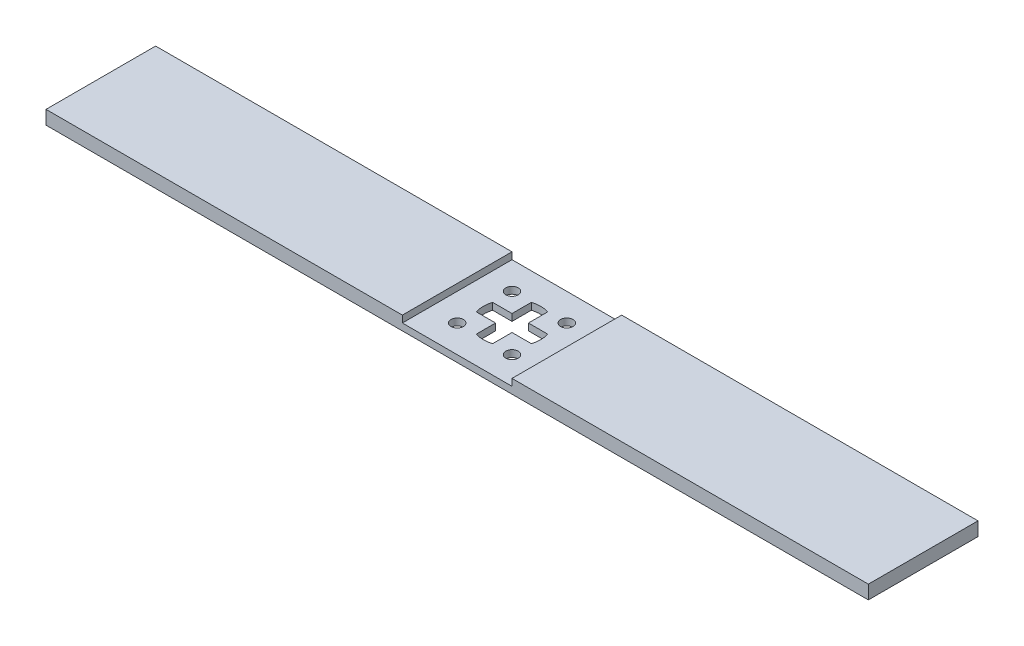
ISO-10303-21;
HEADER;
FILE_DESCRIPTION(('STEP AP214'),'2;1');
FILE_NAME('part.step','',(''),(''),'','','');
FILE_SCHEMA(('AUTOMOTIVE_DESIGN { 1 0 10303 214 1 1 1 1 }'));
ENDSEC;
DATA;
#1=APPLICATION_CONTEXT('core data for automotive mechanical design processes');
#2=APPLICATION_PROTOCOL_DEFINITION('international standard','automotive_design',2000,#1);
#3=PRODUCT_CONTEXT('',#1,'mechanical');
#4=PRODUCT('Part','Part','',(#3));
#5=PRODUCT_RELATED_PRODUCT_CATEGORY('part','',(#4));
#6=PRODUCT_DEFINITION_FORMATION('','',#4);
#7=PRODUCT_DEFINITION_CONTEXT('part definition',#1,'design');
#8=PRODUCT_DEFINITION('design','',#6,#7);
#9=PRODUCT_DEFINITION_SHAPE('','',#8);
#10=(LENGTH_UNIT() NAMED_UNIT(*) SI_UNIT(.MILLI.,.METRE.));
#11=(NAMED_UNIT(*) PLANE_ANGLE_UNIT() SI_UNIT($,.RADIAN.));
#12=(NAMED_UNIT(*) SI_UNIT($,.STERADIAN.) SOLID_ANGLE_UNIT());
#13=UNCERTAINTY_MEASURE_WITH_UNIT(LENGTH_MEASURE(1.E-05),#10,'distance_accuracy_value','');
#14=(GEOMETRIC_REPRESENTATION_CONTEXT(3) GLOBAL_UNCERTAINTY_ASSIGNED_CONTEXT((#13)) GLOBAL_UNIT_ASSIGNED_CONTEXT((#10,
#11,#12)) REPRESENTATION_CONTEXT('',''));
#15=CARTESIAN_POINT('',(0.,0.,0.));
#16=DIRECTION('',(0.,0.,1.));
#17=DIRECTION('',(1.,0.,0.));
#18=AXIS2_PLACEMENT_3D('',#15,#16,#17);
#19=CARTESIAN_POINT('',(0.,2.5,0.));
#20=DIRECTION('',(0.,1.,0.));
#21=DIRECTION('',(0.,0.,1.));
#22=AXIS2_PLACEMENT_3D('',#19,#20,#21);
#23=PLANE('',#22);
#24=DIRECTION('',(0.,0.,1.));
#25=VECTOR('',#24,1.);
#26=CARTESIAN_POINT('',(20.,2.5,-20.));
#27=LINE('',#26,#25);
#28=CARTESIAN_POINT('',(20.,2.5,-20.));
#29=VERTEX_POINT('',#28);
#30=CARTESIAN_POINT('',(20.,2.5,20.));
#31=VERTEX_POINT('',#30);
#32=EDGE_CURVE('E248',#29,#31,#27,.T.);
#33=ORIENTED_EDGE('',*,*,#32,.T.);
#34=DIRECTION('',(1.,0.,0.));
#35=VECTOR('',#34,1.);
#36=CARTESIAN_POINT('',(-150.,2.5,20.));
#37=LINE('',#36,#35);
#38=CARTESIAN_POINT('',(150.,2.5,20.));
#39=VERTEX_POINT('',#38);
#40=EDGE_CURVE('E202',#31,#39,#37,.T.);
#41=ORIENTED_EDGE('',*,*,#40,.T.);
#42=DIRECTION('',(0.,0.,-1.));
#43=VECTOR('',#42,1.);
#44=CARTESIAN_POINT('',(150.,2.5,-20.));
#45=LINE('',#44,#43);
#46=CARTESIAN_POINT('',(150.,2.5,-20.));
#47=VERTEX_POINT('',#46);
#48=EDGE_CURVE('E192',#39,#47,#45,.T.);
#49=ORIENTED_EDGE('',*,*,#48,.T.);
#50=DIRECTION('',(-1.,0.,0.));
#51=VECTOR('',#50,1.);
#52=CARTESIAN_POINT('',(-150.,2.5,-20.));
#53=LINE('',#52,#51);
#54=EDGE_CURVE('E191',#47,#29,#53,.T.);
#55=ORIENTED_EDGE('',*,*,#54,.T.);
#56=EDGE_LOOP('',(#33,#41,#49,#55));
#57=FACE_BOUND('',#56,.T.);
#58=ADVANCED_FACE('F33',(#57),#23,.T.);
#59=DIRECTION('',(0.,0.,1.));
#60=VECTOR('',#59,1.);
#61=CARTESIAN_POINT('',(-20.,2.5,-20.));
#62=LINE('',#61,#60);
#63=CARTESIAN_POINT('',(-20.,2.5,-20.));
#64=VERTEX_POINT('',#63);
#65=CARTESIAN_POINT('',(-20.,2.5,20.));
#66=VERTEX_POINT('',#65);
#67=EDGE_CURVE('E48',#64,#66,#62,.T.);
#68=ORIENTED_EDGE('',*,*,#67,.F.);
#69=CARTESIAN_POINT('',(-150.,2.5,-20.));
#70=VERTEX_POINT('',#69);
#71=EDGE_CURVE('E181',#64,#70,#53,.T.);
#72=ORIENTED_EDGE('',*,*,#71,.T.);
#73=DIRECTION('',(0.,0.,1.));
#74=VECTOR('',#73,1.);
#75=CARTESIAN_POINT('',(-150.,2.5,-20.));
#76=LINE('',#75,#74);
#77=CARTESIAN_POINT('',(-150.,2.5,20.));
#78=VERTEX_POINT('',#77);
#79=EDGE_CURVE('E195',#70,#78,#76,.T.);
#80=ORIENTED_EDGE('',*,*,#79,.T.);
#81=EDGE_CURVE('E184',#78,#66,#37,.T.);
#82=ORIENTED_EDGE('',*,*,#81,.T.);
#83=EDGE_LOOP('',(#68,#72,#80,#82));
#84=FACE_BOUND('',#83,.T.);
#85=ADVANCED_FACE('F180',(#84),#23,.T.);
#86=CARTESIAN_POINT('',(0.,-2.5,0.));
#87=DIRECTION('',(0.,1.,0.));
#88=DIRECTION('',(0.,0.,1.));
#89=AXIS2_PLACEMENT_3D('',#86,#87,#88);
#90=PLANE('',#89);
#91=CARTESIAN_POINT('',(-10.,-2.5,-10.));
#92=DIRECTION('',(0.,1.,0.));
#93=DIRECTION('',(0.,0.,1.));
#94=AXIS2_PLACEMENT_3D('',#91,#92,#93);
#95=CIRCLE('',#94,2.25);
#96=CARTESIAN_POINT('',(-10.,-2.5,-7.75));
#97=VERTEX_POINT('',#96);
#98=EDGE_CURVE('E347',#97,#97,#95,.T.);
#99=ORIENTED_EDGE('',*,*,#98,.T.);
#100=EDGE_LOOP('',(#99));
#101=FACE_BOUND('',#100,.T.);
#102=CARTESIAN_POINT('',(-10.,-2.5,10.));
#103=DIRECTION('',(0.,1.,0.));
#104=DIRECTION('',(0.,0.,-1.));
#105=AXIS2_PLACEMENT_3D('',#102,#103,#104);
#106=CIRCLE('',#105,2.25);
#107=CARTESIAN_POINT('',(-10.,-2.5,7.75));
#108=VERTEX_POINT('',#107);
#109=EDGE_CURVE('E350',#108,#108,#106,.T.);
#110=ORIENTED_EDGE('',*,*,#109,.T.);
#111=EDGE_LOOP('',(#110));
#112=FACE_BOUND('',#111,.T.);
#113=CARTESIAN_POINT('',(10.,-2.5,-10.));
#114=DIRECTION('',(0.,1.,0.));
#115=DIRECTION('',(0.,0.,-1.));
#116=AXIS2_PLACEMENT_3D('',#113,#114,#115);
#117=CIRCLE('',#116,2.25);
#118=CARTESIAN_POINT('',(10.,-2.5,-12.25));
#119=VERTEX_POINT('',#118);
#120=EDGE_CURVE('E353',#119,#119,#117,.T.);
#121=ORIENTED_EDGE('',*,*,#120,.T.);
#122=EDGE_LOOP('',(#121));
#123=FACE_BOUND('',#122,.T.);
#124=CARTESIAN_POINT('',(10.,-2.5,10.));
#125=DIRECTION('',(0.,1.,0.));
#126=DIRECTION('',(0.,0.,1.));
#127=AXIS2_PLACEMENT_3D('',#124,#125,#126);
#128=CIRCLE('',#127,2.25);
#129=CARTESIAN_POINT('',(10.,-2.5,12.25));
#130=VERTEX_POINT('',#129);
#131=EDGE_CURVE('E209',#130,#130,#128,.T.);
#132=ORIENTED_EDGE('',*,*,#131,.T.);
#133=EDGE_LOOP('',(#132));
#134=FACE_BOUND('',#133,.T.);
#135=DIRECTION('',(0.,0.,-1.));
#136=VECTOR('',#135,1.);
#137=CARTESIAN_POINT('',(150.,-2.5,-20.));
#138=LINE('',#137,#136);
#139=CARTESIAN_POINT('',(150.,-2.5,20.));
#140=VERTEX_POINT('',#139);
#141=CARTESIAN_POINT('',(150.,-2.5,-20.));
#142=VERTEX_POINT('',#141);
#143=EDGE_CURVE('E205',#140,#142,#138,.T.);
#144=ORIENTED_EDGE('',*,*,#143,.F.);
#145=DIRECTION('',(1.,0.,0.));
#146=VECTOR('',#145,1.);
#147=CARTESIAN_POINT('',(-150.,-2.5,20.));
#148=LINE('',#147,#146);
#149=CARTESIAN_POINT('',(-150.,-2.5,20.));
#150=VERTEX_POINT('',#149);
#151=EDGE_CURVE('E197',#150,#140,#148,.T.);
#152=ORIENTED_EDGE('',*,*,#151,.F.);
#153=DIRECTION('',(0.,0.,1.));
#154=VECTOR('',#153,1.);
#155=CARTESIAN_POINT('',(-150.,-2.5,-20.));
#156=LINE('',#155,#154);
#157=CARTESIAN_POINT('',(-150.,-2.5,-20.));
#158=VERTEX_POINT('',#157);
#159=EDGE_CURVE('E211',#158,#150,#156,.T.);
#160=ORIENTED_EDGE('',*,*,#159,.F.);
#161=DIRECTION('',(-1.,0.,0.));
#162=VECTOR('',#161,1.);
#163=CARTESIAN_POINT('',(-150.,-2.5,-20.));
#164=LINE('',#163,#162);
#165=EDGE_CURVE('E208',#142,#158,#164,.T.);
#166=ORIENTED_EDGE('',*,*,#165,.F.);
#167=EDGE_LOOP('',(#144,#152,#160,#166));
#168=FACE_BOUND('',#167,.T.);
#169=DIRECTION('',(1.,0.,0.));
#170=VECTOR('',#169,1.);
#171=CARTESIAN_POINT('',(-10.0623058987491,-2.5,3.));
#172=LINE('',#171,#170);
#173=CARTESIAN_POINT('',(-10.0623058987491,-2.5,3.));
#174=VERTEX_POINT('',#173);
#175=CARTESIAN_POINT('',(-3.,-2.5,3.));
#176=VERTEX_POINT('',#175);
#177=EDGE_CURVE('E287',#174,#176,#172,.T.);
#178=ORIENTED_EDGE('',*,*,#177,.T.);
#179=DIRECTION('',(0.,0.,1.));
#180=VECTOR('',#179,1.);
#181=CARTESIAN_POINT('',(-3.,-2.5,3.));
#182=LINE('',#181,#180);
#183=CARTESIAN_POINT('',(-3.,-2.5,10.0623058987491));
#184=VERTEX_POINT('',#183);
#185=EDGE_CURVE('E290',#176,#184,#182,.T.);
#186=ORIENTED_EDGE('',*,*,#185,.T.);
#187=CARTESIAN_POINT('',(0.,-2.5,0.));
#188=DIRECTION('',(0.,1.,0.));
#189=DIRECTION('',(0.,0.,1.));
#190=AXIS2_PLACEMENT_3D('',#187,#188,#189);
#191=CIRCLE('',#190,10.5);
#192=CARTESIAN_POINT('',(3.,-2.5,10.0623058987491));
#193=VERTEX_POINT('',#192);
#194=EDGE_CURVE('E293',#184,#193,#191,.T.);
#195=ORIENTED_EDGE('',*,*,#194,.T.);
#196=DIRECTION('',(0.,0.,-1.));
#197=VECTOR('',#196,1.);
#198=CARTESIAN_POINT('',(3.,-2.5,10.0623058987491));
#199=LINE('',#198,#197);
#200=CARTESIAN_POINT('',(3.,-2.5,3.));
#201=VERTEX_POINT('',#200);
#202=EDGE_CURVE('E296',#193,#201,#199,.T.);
#203=ORIENTED_EDGE('',*,*,#202,.T.);
#204=DIRECTION('',(1.,0.,0.));
#205=VECTOR('',#204,1.);
#206=CARTESIAN_POINT('',(3.,-2.5,3.));
#207=LINE('',#206,#205);
#208=CARTESIAN_POINT('',(10.0623058987491,-2.5,3.));
#209=VERTEX_POINT('',#208);
#210=EDGE_CURVE('E299',#201,#209,#207,.T.);
#211=ORIENTED_EDGE('',*,*,#210,.T.);
#212=CARTESIAN_POINT('',(0.,-2.5,0.));
#213=DIRECTION('',(0.,1.,0.));
#214=DIRECTION('',(0.,0.,1.));
#215=AXIS2_PLACEMENT_3D('',#212,#213,#214);
#216=CIRCLE('',#215,10.5);
#217=CARTESIAN_POINT('',(10.0623058987491,-2.5,-3.));
#218=VERTEX_POINT('',#217);
#219=EDGE_CURVE('E302',#209,#218,#216,.T.);
#220=ORIENTED_EDGE('',*,*,#219,.T.);
#221=DIRECTION('',(-1.,0.,0.));
#222=VECTOR('',#221,1.);
#223=CARTESIAN_POINT('',(10.0623058987491,-2.5,-3.));
#224=LINE('',#223,#222);
#225=CARTESIAN_POINT('',(3.,-2.5,-3.));
#226=VERTEX_POINT('',#225);
#227=EDGE_CURVE('E305',#218,#226,#224,.T.);
#228=ORIENTED_EDGE('',*,*,#227,.T.);
#229=DIRECTION('',(0.,0.,-1.));
#230=VECTOR('',#229,1.);
#231=CARTESIAN_POINT('',(3.,-2.5,-3.));
#232=LINE('',#231,#230);
#233=CARTESIAN_POINT('',(3.,-2.5,-10.0623058987491));
#234=VERTEX_POINT('',#233);
#235=EDGE_CURVE('E308',#226,#234,#232,.T.);
#236=ORIENTED_EDGE('',*,*,#235,.T.);
#237=CARTESIAN_POINT('',(0.,-2.5,0.));
#238=DIRECTION('',(0.,1.,0.));
#239=DIRECTION('',(0.,0.,1.));
#240=AXIS2_PLACEMENT_3D('',#237,#238,#239);
#241=CIRCLE('',#240,10.5);
#242=CARTESIAN_POINT('',(-3.,-2.5,-10.0623058987491));
#243=VERTEX_POINT('',#242);
#244=EDGE_CURVE('E311',#234,#243,#241,.T.);
#245=ORIENTED_EDGE('',*,*,#244,.T.);
#246=DIRECTION('',(0.,0.,1.));
#247=VECTOR('',#246,1.);
#248=CARTESIAN_POINT('',(-3.,-2.5,-10.0623058987491));
#249=LINE('',#248,#247);
#250=CARTESIAN_POINT('',(-3.,-2.5,-3.));
#251=VERTEX_POINT('',#250);
#252=EDGE_CURVE('E314',#243,#251,#249,.T.);
#253=ORIENTED_EDGE('',*,*,#252,.T.);
#254=DIRECTION('',(-1.,0.,0.));
#255=VECTOR('',#254,1.);
#256=CARTESIAN_POINT('',(-3.,-2.5,-3.));
#257=LINE('',#256,#255);
#258=CARTESIAN_POINT('',(-10.0623058987491,-2.5,-3.));
#259=VERTEX_POINT('',#258);
#260=EDGE_CURVE('E317',#251,#259,#257,.T.);
#261=ORIENTED_EDGE('',*,*,#260,.T.);
#262=CARTESIAN_POINT('',(0.,-2.5,0.));
#263=DIRECTION('',(0.,1.,0.));
#264=DIRECTION('',(0.,0.,1.));
#265=AXIS2_PLACEMENT_3D('',#262,#263,#264);
#266=CIRCLE('',#265,10.5);
#267=EDGE_CURVE('E320',#259,#174,#266,.T.);
#268=ORIENTED_EDGE('',*,*,#267,.T.);
#269=EDGE_LOOP('',(#178,#186,#195,#203,#211,#220,#228,#236,#245,#253,#261,#268));
#270=FACE_BOUND('',#269,.T.);
#271=ADVANCED_FACE('F228',(#101,#112,#123,#134,#168,#270),#90,.F.);
#272=CARTESIAN_POINT('',(150.,2.5,-20.));
#273=DIRECTION('',(-1.,0.,0.));
#274=DIRECTION('',(0.,0.,1.));
#275=AXIS2_PLACEMENT_3D('',#272,#273,#274);
#276=PLANE('',#275);
#277=ORIENTED_EDGE('',*,*,#143,.T.);
#278=DIRECTION('',(0.,-1.,0.));
#279=VECTOR('',#278,1.);
#280=CARTESIAN_POINT('',(150.,2.5,-20.));
#281=LINE('',#280,#279);
#282=EDGE_CURVE('E41',#47,#142,#281,.T.);
#283=ORIENTED_EDGE('',*,*,#282,.F.);
#284=ORIENTED_EDGE('',*,*,#48,.F.);
#285=DIRECTION('',(0.,-1.,0.));
#286=VECTOR('',#285,1.);
#287=CARTESIAN_POINT('',(150.,2.5,20.));
#288=LINE('',#287,#286);
#289=EDGE_CURVE('E204',#39,#140,#288,.T.);
#290=ORIENTED_EDGE('',*,*,#289,.T.);
#291=EDGE_LOOP('',(#277,#283,#284,#290));
#292=FACE_BOUND('',#291,.T.);
#293=ADVANCED_FACE('F35',(#292),#276,.F.);
#294=CARTESIAN_POINT('',(-150.,2.5,-20.));
#295=DIRECTION('',(0.,0.,1.));
#296=DIRECTION('',(1.,0.,0.));
#297=AXIS2_PLACEMENT_3D('',#294,#295,#296);
#298=PLANE('',#297);
#299=DIRECTION('',(1.,0.,0.));
#300=VECTOR('',#299,1.);
#301=CARTESIAN_POINT('',(-20.,0.,-20.));
#302=LINE('',#301,#300);
#303=CARTESIAN_POINT('',(-20.,0.,-20.));
#304=VERTEX_POINT('',#303);
#305=CARTESIAN_POINT('',(20.,0.,-20.));
#306=VERTEX_POINT('',#305);
#307=EDGE_CURVE('E175',#304,#306,#302,.T.);
#308=ORIENTED_EDGE('',*,*,#307,.T.);
#309=DIRECTION('',(0.,1.,0.));
#310=VECTOR('',#309,1.);
#311=CARTESIAN_POINT('',(20.,0.,-20.));
#312=LINE('',#311,#310);
#313=EDGE_CURVE('E185',#306,#29,#312,.T.);
#314=ORIENTED_EDGE('',*,*,#313,.T.);
#315=ORIENTED_EDGE('',*,*,#54,.F.);
#316=ORIENTED_EDGE('',*,*,#282,.T.);
#317=ORIENTED_EDGE('',*,*,#165,.T.);
#318=DIRECTION('',(0.,-1.,0.));
#319=VECTOR('',#318,1.);
#320=CARTESIAN_POINT('',(-150.,2.5,-20.));
#321=LINE('',#320,#319);
#322=EDGE_CURVE('E189',#70,#158,#321,.T.);
#323=ORIENTED_EDGE('',*,*,#322,.F.);
#324=ORIENTED_EDGE('',*,*,#71,.F.);
#325=DIRECTION('',(0.,-1.,0.));
#326=VECTOR('',#325,1.);
#327=CARTESIAN_POINT('',(-20.,2.5,-20.));
#328=LINE('',#327,#326);
#329=EDGE_CURVE('E168',#64,#304,#328,.T.);
#330=ORIENTED_EDGE('',*,*,#329,.T.);
#331=EDGE_LOOP('',(#308,#314,#315,#316,#317,#323,#324,#330));
#332=FACE_BOUND('',#331,.T.);
#333=ADVANCED_FACE('F187',(#332),#298,.F.);
#334=CARTESIAN_POINT('',(-150.,2.5,-20.));
#335=DIRECTION('',(1.,0.,0.));
#336=DIRECTION('',(0.,0.,-1.));
#337=AXIS2_PLACEMENT_3D('',#334,#335,#336);
#338=PLANE('',#337);
#339=ORIENTED_EDGE('',*,*,#159,.T.);
#340=DIRECTION('',(0.,-1.,0.));
#341=VECTOR('',#340,1.);
#342=CARTESIAN_POINT('',(-150.,2.5,20.));
#343=LINE('',#342,#341);
#344=EDGE_CURVE('E216',#78,#150,#343,.T.);
#345=ORIENTED_EDGE('',*,*,#344,.F.);
#346=ORIENTED_EDGE('',*,*,#79,.F.);
#347=ORIENTED_EDGE('',*,*,#322,.T.);
#348=EDGE_LOOP('',(#339,#345,#346,#347));
#349=FACE_BOUND('',#348,.T.);
#350=ADVANCED_FACE('F233',(#349),#338,.F.);
#351=CARTESIAN_POINT('',(-150.,2.5,20.));
#352=DIRECTION('',(0.,0.,-1.));
#353=DIRECTION('',(-1.,0.,0.));
#354=AXIS2_PLACEMENT_3D('',#351,#352,#353);
#355=PLANE('',#354);
#356=ORIENTED_EDGE('',*,*,#40,.F.);
#357=DIRECTION('',(0.,1.,0.));
#358=VECTOR('',#357,1.);
#359=CARTESIAN_POINT('',(20.,0.,20.));
#360=LINE('',#359,#358);
#361=CARTESIAN_POINT('',(20.,0.,20.));
#362=VERTEX_POINT('',#361);
#363=EDGE_CURVE('E176',#362,#31,#360,.T.);
#364=ORIENTED_EDGE('',*,*,#363,.F.);
#365=DIRECTION('',(1.,0.,0.));
#366=VECTOR('',#365,1.);
#367=CARTESIAN_POINT('',(-20.,0.,20.));
#368=LINE('',#367,#366);
#369=CARTESIAN_POINT('',(-20.,0.,20.));
#370=VERTEX_POINT('',#369);
#371=EDGE_CURVE('E241',#370,#362,#368,.T.);
#372=ORIENTED_EDGE('',*,*,#371,.F.);
#373=DIRECTION('',(0.,-1.,0.));
#374=VECTOR('',#373,1.);
#375=CARTESIAN_POINT('',(-20.,2.5,20.));
#376=LINE('',#375,#374);
#377=EDGE_CURVE('E238',#66,#370,#376,.T.);
#378=ORIENTED_EDGE('',*,*,#377,.F.);
#379=ORIENTED_EDGE('',*,*,#81,.F.);
#380=ORIENTED_EDGE('',*,*,#344,.T.);
#381=ORIENTED_EDGE('',*,*,#151,.T.);
#382=ORIENTED_EDGE('',*,*,#289,.F.);
#383=EDGE_LOOP('',(#356,#364,#372,#378,#379,#380,#381,#382));
#384=FACE_BOUND('',#383,.T.);
#385=ADVANCED_FACE('F236',(#384),#355,.F.);
#386=CARTESIAN_POINT('',(10.,2.5,10.));
#387=DIRECTION('',(0.,-1.,0.));
#388=DIRECTION('',(0.,0.,-1.));
#389=AXIS2_PLACEMENT_3D('',#386,#387,#388);
#390=CYLINDRICAL_SURFACE('',#389,2.25);
#391=CARTESIAN_POINT('',(10.,0.,10.));
#392=DIRECTION('',(0.,-1.,0.));
#393=DIRECTION('',(1.,0.,0.));
#394=AXIS2_PLACEMENT_3D('',#391,#392,#393);
#395=CIRCLE('',#394,2.25);
#396=CARTESIAN_POINT('',(12.25,0.,10.));
#397=VERTEX_POINT('',#396);
#398=EDGE_CURVE('E284',#397,#397,#395,.T.);
#399=ORIENTED_EDGE('',*,*,#398,.F.);
#400=EDGE_LOOP('',(#399));
#401=FACE_BOUND('',#400,.T.);
#402=ORIENTED_EDGE('',*,*,#131,.F.);
#403=EDGE_LOOP('',(#402));
#404=FACE_BOUND('',#403,.T.);
#405=ADVANCED_FACE('F359',(#401,#404),#390,.F.);
#406=CARTESIAN_POINT('',(10.,2.5,-10.));
#407=DIRECTION('',(0.,-1.,0.));
#408=DIRECTION('',(0.,0.,-1.));
#409=AXIS2_PLACEMENT_3D('',#406,#407,#408);
#410=CYLINDRICAL_SURFACE('',#409,2.25);
#411=CARTESIAN_POINT('',(10.,0.,-10.));
#412=DIRECTION('',(0.,-1.,0.));
#413=DIRECTION('',(1.,0.,0.));
#414=AXIS2_PLACEMENT_3D('',#411,#412,#413);
#415=CIRCLE('',#414,2.25);
#416=CARTESIAN_POINT('',(12.25,0.,-10.));
#417=VERTEX_POINT('',#416);
#418=EDGE_CURVE('E281',#417,#417,#415,.T.);
#419=ORIENTED_EDGE('',*,*,#418,.F.);
#420=EDGE_LOOP('',(#419));
#421=FACE_BOUND('',#420,.T.);
#422=ORIENTED_EDGE('',*,*,#120,.F.);
#423=EDGE_LOOP('',(#422));
#424=FACE_BOUND('',#423,.T.);
#425=ADVANCED_FACE('F361',(#421,#424),#410,.F.);
#426=CARTESIAN_POINT('',(-10.,2.5,10.));
#427=DIRECTION('',(0.,-1.,0.));
#428=DIRECTION('',(0.,0.,-1.));
#429=AXIS2_PLACEMENT_3D('',#426,#427,#428);
#430=CYLINDRICAL_SURFACE('',#429,2.25);
#431=CARTESIAN_POINT('',(-10.,0.,10.));
#432=DIRECTION('',(0.,-1.,0.));
#433=DIRECTION('',(1.,0.,0.));
#434=AXIS2_PLACEMENT_3D('',#431,#432,#433);
#435=CIRCLE('',#434,2.25);
#436=CARTESIAN_POINT('',(-7.75,0.,10.));
#437=VERTEX_POINT('',#436);
#438=EDGE_CURVE('E278',#437,#437,#435,.T.);
#439=ORIENTED_EDGE('',*,*,#438,.F.);
#440=EDGE_LOOP('',(#439));
#441=FACE_BOUND('',#440,.T.);
#442=ORIENTED_EDGE('',*,*,#109,.F.);
#443=EDGE_LOOP('',(#442));
#444=FACE_BOUND('',#443,.T.);
#445=ADVANCED_FACE('F368',(#441,#444),#430,.F.);
#446=CARTESIAN_POINT('',(-10.,2.5,-10.));
#447=DIRECTION('',(0.,-1.,0.));
#448=DIRECTION('',(0.,0.,-1.));
#449=AXIS2_PLACEMENT_3D('',#446,#447,#448);
#450=CYLINDRICAL_SURFACE('',#449,2.25);
#451=CARTESIAN_POINT('',(-10.,0.,-10.));
#452=DIRECTION('',(0.,-1.,0.));
#453=DIRECTION('',(1.,0.,0.));
#454=AXIS2_PLACEMENT_3D('',#451,#452,#453);
#455=CIRCLE('',#454,2.25);
#456=CARTESIAN_POINT('',(-7.75,0.,-10.));
#457=VERTEX_POINT('',#456);
#458=EDGE_CURVE('E275',#457,#457,#455,.T.);
#459=ORIENTED_EDGE('',*,*,#458,.F.);
#460=EDGE_LOOP('',(#459));
#461=FACE_BOUND('',#460,.T.);
#462=ORIENTED_EDGE('',*,*,#98,.F.);
#463=EDGE_LOOP('',(#462));
#464=FACE_BOUND('',#463,.T.);
#465=ADVANCED_FACE('F431',(#461,#464),#450,.F.);
#466=CARTESIAN_POINT('',(-10.0623058987491,2.5,3.));
#467=DIRECTION('',(0.,0.,-1.));
#468=DIRECTION('',(-1.,0.,0.));
#469=AXIS2_PLACEMENT_3D('',#466,#467,#468);
#470=PLANE('',#469);
#471=DIRECTION('',(-1.,0.,0.));
#472=VECTOR('',#471,1.);
#473=CARTESIAN_POINT('',(-10.0623058987491,0.,3.));
#474=LINE('',#473,#472);
#475=CARTESIAN_POINT('',(-3.,0.,3.));
#476=VERTEX_POINT('',#475);
#477=CARTESIAN_POINT('',(-10.0623058987491,0.,3.));
#478=VERTEX_POINT('',#477);
#479=EDGE_CURVE('E55',#476,#478,#474,.T.);
#480=ORIENTED_EDGE('',*,*,#479,.F.);
#481=DIRECTION('',(0.,-1.,0.));
#482=VECTOR('',#481,1.);
#483=CARTESIAN_POINT('',(-3.,2.5,3.));
#484=LINE('',#483,#482);
#485=EDGE_CURVE('E345',#476,#176,#484,.T.);
#486=ORIENTED_EDGE('',*,*,#485,.T.);
#487=ORIENTED_EDGE('',*,*,#177,.F.);
#488=DIRECTION('',(0.,-1.,0.));
#489=VECTOR('',#488,1.);
#490=CARTESIAN_POINT('',(-10.0623058987491,2.5,3.));
#491=LINE('',#490,#489);
#492=EDGE_CURVE('E323',#478,#174,#491,.T.);
#493=ORIENTED_EDGE('',*,*,#492,.F.);
#494=EDGE_LOOP('',(#480,#486,#487,#493));
#495=FACE_BOUND('',#494,.T.);
#496=ADVANCED_FACE('F441',(#495),#470,.T.);
#497=CARTESIAN_POINT('',(-3.,2.5,3.));
#498=DIRECTION('',(1.,0.,0.));
#499=DIRECTION('',(0.,0.,-1.));
#500=AXIS2_PLACEMENT_3D('',#497,#498,#499);
#501=PLANE('',#500);
#502=DIRECTION('',(0.,0.,-1.));
#503=VECTOR('',#502,1.);
#504=CARTESIAN_POINT('',(-3.,0.,3.));
#505=LINE('',#504,#503);
#506=CARTESIAN_POINT('',(-3.,0.,10.0623058987491));
#507=VERTEX_POINT('',#506);
#508=EDGE_CURVE('E272',#507,#476,#505,.T.);
#509=ORIENTED_EDGE('',*,*,#508,.F.);
#510=DIRECTION('',(0.,-1.,0.));
#511=VECTOR('',#510,1.);
#512=CARTESIAN_POINT('',(-3.,2.5,10.0623058987491));
#513=LINE('',#512,#511);
#514=EDGE_CURVE('E343',#507,#184,#513,.T.);
#515=ORIENTED_EDGE('',*,*,#514,.T.);
#516=ORIENTED_EDGE('',*,*,#185,.F.);
#517=ORIENTED_EDGE('',*,*,#485,.F.);
#518=EDGE_LOOP('',(#509,#515,#516,#517));
#519=FACE_BOUND('',#518,.T.);
#520=ADVANCED_FACE('F451',(#519),#501,.T.);
#521=CARTESIAN_POINT('',(0.,2.5,0.));
#522=DIRECTION('',(0.,-1.,0.));
#523=DIRECTION('',(0.,0.,-1.));
#524=AXIS2_PLACEMENT_3D('',#521,#522,#523);
#525=CYLINDRICAL_SURFACE('',#524,10.5);
#526=CARTESIAN_POINT('',(0.,0.,0.));
#527=DIRECTION('',(0.,-1.,0.));
#528=DIRECTION('',(1.,0.,0.));
#529=AXIS2_PLACEMENT_3D('',#526,#527,#528);
#530=CIRCLE('',#529,10.5);
#531=CARTESIAN_POINT('',(3.,0.,10.0623058987491));
#532=VERTEX_POINT('',#531);
#533=EDGE_CURVE('E270',#532,#507,#530,.T.);
#534=ORIENTED_EDGE('',*,*,#533,.F.);
#535=DIRECTION('',(0.,-1.,0.));
#536=VECTOR('',#535,1.);
#537=CARTESIAN_POINT('',(3.,2.5,10.0623058987491));
#538=LINE('',#537,#536);
#539=EDGE_CURVE('E341',#532,#193,#538,.T.);
#540=ORIENTED_EDGE('',*,*,#539,.T.);
#541=ORIENTED_EDGE('',*,*,#194,.F.);
#542=ORIENTED_EDGE('',*,*,#514,.F.);
#543=EDGE_LOOP('',(#534,#540,#541,#542));
#544=FACE_BOUND('',#543,.T.);
#545=ADVANCED_FACE('F461',(#544),#525,.F.);
#546=CARTESIAN_POINT('',(3.,2.5,10.0623058987491));
#547=DIRECTION('',(-1.,0.,0.));
#548=DIRECTION('',(0.,0.,1.));
#549=AXIS2_PLACEMENT_3D('',#546,#547,#548);
#550=PLANE('',#549);
#551=DIRECTION('',(0.,0.,1.));
#552=VECTOR('',#551,1.);
#553=CARTESIAN_POINT('',(3.,0.,10.0623058987491));
#554=LINE('',#553,#552);
#555=CARTESIAN_POINT('',(3.,0.,3.));
#556=VERTEX_POINT('',#555);
#557=EDGE_CURVE('E268',#556,#532,#554,.T.);
#558=ORIENTED_EDGE('',*,*,#557,.F.);
#559=DIRECTION('',(0.,-1.,0.));
#560=VECTOR('',#559,1.);
#561=CARTESIAN_POINT('',(3.,2.5,3.));
#562=LINE('',#561,#560);
#563=EDGE_CURVE('E339',#556,#201,#562,.T.);
#564=ORIENTED_EDGE('',*,*,#563,.T.);
#565=ORIENTED_EDGE('',*,*,#202,.F.);
#566=ORIENTED_EDGE('',*,*,#539,.F.);
#567=EDGE_LOOP('',(#558,#564,#565,#566));
#568=FACE_BOUND('',#567,.T.);
#569=ADVANCED_FACE('F471',(#568),#550,.T.);
#570=CARTESIAN_POINT('',(3.,2.5,3.));
#571=DIRECTION('',(0.,0.,-1.));
#572=DIRECTION('',(-1.,0.,0.));
#573=AXIS2_PLACEMENT_3D('',#570,#571,#572);
#574=PLANE('',#573);
#575=DIRECTION('',(-1.,0.,0.));
#576=VECTOR('',#575,1.);
#577=CARTESIAN_POINT('',(3.,0.,3.));
#578=LINE('',#577,#576);
#579=CARTESIAN_POINT('',(10.0623058987491,0.,3.));
#580=VERTEX_POINT('',#579);
#581=EDGE_CURVE('E266',#580,#556,#578,.T.);
#582=ORIENTED_EDGE('',*,*,#581,.F.);
#583=DIRECTION('',(0.,-1.,0.));
#584=VECTOR('',#583,1.);
#585=CARTESIAN_POINT('',(10.0623058987491,2.5,3.));
#586=LINE('',#585,#584);
#587=EDGE_CURVE('E337',#580,#209,#586,.T.);
#588=ORIENTED_EDGE('',*,*,#587,.T.);
#589=ORIENTED_EDGE('',*,*,#210,.F.);
#590=ORIENTED_EDGE('',*,*,#563,.F.);
#591=EDGE_LOOP('',(#582,#588,#589,#590));
#592=FACE_BOUND('',#591,.T.);
#593=ADVANCED_FACE('F481',(#592),#574,.T.);
#594=CARTESIAN_POINT('',(0.,2.5,0.));
#595=DIRECTION('',(0.,-1.,0.));
#596=DIRECTION('',(0.,0.,-1.));
#597=AXIS2_PLACEMENT_3D('',#594,#595,#596);
#598=CYLINDRICAL_SURFACE('',#597,10.5);
#599=CARTESIAN_POINT('',(0.,0.,0.));
#600=DIRECTION('',(0.,-1.,0.));
#601=DIRECTION('',(1.,0.,0.));
#602=AXIS2_PLACEMENT_3D('',#599,#600,#601);
#603=CIRCLE('',#602,10.5);
#604=CARTESIAN_POINT('',(10.0623058987491,0.,-3.));
#605=VERTEX_POINT('',#604);
#606=EDGE_CURVE('E264',#605,#580,#603,.T.);
#607=ORIENTED_EDGE('',*,*,#606,.F.);
#608=DIRECTION('',(0.,-1.,0.));
#609=VECTOR('',#608,1.);
#610=CARTESIAN_POINT('',(10.0623058987491,2.5,-3.));
#611=LINE('',#610,#609);
#612=EDGE_CURVE('E335',#605,#218,#611,.T.);
#613=ORIENTED_EDGE('',*,*,#612,.T.);
#614=ORIENTED_EDGE('',*,*,#219,.F.);
#615=ORIENTED_EDGE('',*,*,#587,.F.);
#616=EDGE_LOOP('',(#607,#613,#614,#615));
#617=FACE_BOUND('',#616,.T.);
#618=ADVANCED_FACE('F491',(#617),#598,.F.);
#619=CARTESIAN_POINT('',(10.0623058987491,2.5,-3.));
#620=DIRECTION('',(0.,0.,1.));
#621=DIRECTION('',(1.,0.,0.));
#622=AXIS2_PLACEMENT_3D('',#619,#620,#621);
#623=PLANE('',#622);
#624=DIRECTION('',(1.,0.,0.));
#625=VECTOR('',#624,1.);
#626=CARTESIAN_POINT('',(10.0623058987491,0.,-3.));
#627=LINE('',#626,#625);
#628=CARTESIAN_POINT('',(3.,0.,-3.));
#629=VERTEX_POINT('',#628);
#630=EDGE_CURVE('E262',#629,#605,#627,.T.);
#631=ORIENTED_EDGE('',*,*,#630,.F.);
#632=DIRECTION('',(0.,-1.,0.));
#633=VECTOR('',#632,1.);
#634=CARTESIAN_POINT('',(3.,2.5,-3.));
#635=LINE('',#634,#633);
#636=EDGE_CURVE('E333',#629,#226,#635,.T.);
#637=ORIENTED_EDGE('',*,*,#636,.T.);
#638=ORIENTED_EDGE('',*,*,#227,.F.);
#639=ORIENTED_EDGE('',*,*,#612,.F.);
#640=EDGE_LOOP('',(#631,#637,#638,#639));
#641=FACE_BOUND('',#640,.T.);
#642=ADVANCED_FACE('F501',(#641),#623,.T.);
#643=CARTESIAN_POINT('',(3.,2.5,-3.));
#644=DIRECTION('',(-1.,0.,0.));
#645=DIRECTION('',(0.,0.,1.));
#646=AXIS2_PLACEMENT_3D('',#643,#644,#645);
#647=PLANE('',#646);
#648=DIRECTION('',(0.,0.,1.));
#649=VECTOR('',#648,1.);
#650=CARTESIAN_POINT('',(3.,0.,-3.));
#651=LINE('',#650,#649);
#652=CARTESIAN_POINT('',(3.,0.,-10.0623058987491));
#653=VERTEX_POINT('',#652);
#654=EDGE_CURVE('E260',#653,#629,#651,.T.);
#655=ORIENTED_EDGE('',*,*,#654,.F.);
#656=DIRECTION('',(0.,-1.,0.));
#657=VECTOR('',#656,1.);
#658=CARTESIAN_POINT('',(3.,2.5,-10.0623058987491));
#659=LINE('',#658,#657);
#660=EDGE_CURVE('E331',#653,#234,#659,.T.);
#661=ORIENTED_EDGE('',*,*,#660,.T.);
#662=ORIENTED_EDGE('',*,*,#235,.F.);
#663=ORIENTED_EDGE('',*,*,#636,.F.);
#664=EDGE_LOOP('',(#655,#661,#662,#663));
#665=FACE_BOUND('',#664,.T.);
#666=ADVANCED_FACE('F511',(#665),#647,.T.);
#667=CARTESIAN_POINT('',(0.,2.5,0.));
#668=DIRECTION('',(0.,-1.,0.));
#669=DIRECTION('',(0.,0.,-1.));
#670=AXIS2_PLACEMENT_3D('',#667,#668,#669);
#671=CYLINDRICAL_SURFACE('',#670,10.5);
#672=CARTESIAN_POINT('',(0.,0.,0.));
#673=DIRECTION('',(0.,-1.,0.));
#674=DIRECTION('',(1.,0.,0.));
#675=AXIS2_PLACEMENT_3D('',#672,#673,#674);
#676=CIRCLE('',#675,10.5);
#677=CARTESIAN_POINT('',(-3.,0.,-10.0623058987491));
#678=VERTEX_POINT('',#677);
#679=EDGE_CURVE('E258',#678,#653,#676,.T.);
#680=ORIENTED_EDGE('',*,*,#679,.F.);
#681=DIRECTION('',(0.,-1.,0.));
#682=VECTOR('',#681,1.);
#683=CARTESIAN_POINT('',(-3.,2.5,-10.0623058987491));
#684=LINE('',#683,#682);
#685=EDGE_CURVE('E329',#678,#243,#684,.T.);
#686=ORIENTED_EDGE('',*,*,#685,.T.);
#687=ORIENTED_EDGE('',*,*,#244,.F.);
#688=ORIENTED_EDGE('',*,*,#660,.F.);
#689=EDGE_LOOP('',(#680,#686,#687,#688));
#690=FACE_BOUND('',#689,.T.);
#691=ADVANCED_FACE('F521',(#690),#671,.F.);
#692=CARTESIAN_POINT('',(-3.,2.5,-10.0623058987491));
#693=DIRECTION('',(1.,0.,0.));
#694=DIRECTION('',(0.,0.,-1.));
#695=AXIS2_PLACEMENT_3D('',#692,#693,#694);
#696=PLANE('',#695);
#697=DIRECTION('',(0.,0.,-1.));
#698=VECTOR('',#697,1.);
#699=CARTESIAN_POINT('',(-3.,0.,-10.0623058987491));
#700=LINE('',#699,#698);
#701=CARTESIAN_POINT('',(-3.,0.,-3.));
#702=VERTEX_POINT('',#701);
#703=EDGE_CURVE('E256',#702,#678,#700,.T.);
#704=ORIENTED_EDGE('',*,*,#703,.F.);
#705=DIRECTION('',(0.,-1.,0.));
#706=VECTOR('',#705,1.);
#707=CARTESIAN_POINT('',(-3.,2.5,-3.));
#708=LINE('',#707,#706);
#709=EDGE_CURVE('E327',#702,#251,#708,.T.);
#710=ORIENTED_EDGE('',*,*,#709,.T.);
#711=ORIENTED_EDGE('',*,*,#252,.F.);
#712=ORIENTED_EDGE('',*,*,#685,.F.);
#713=EDGE_LOOP('',(#704,#710,#711,#712));
#714=FACE_BOUND('',#713,.T.);
#715=ADVANCED_FACE('F531',(#714),#696,.T.);
#716=CARTESIAN_POINT('',(-3.,2.5,-3.));
#717=DIRECTION('',(0.,0.,1.));
#718=DIRECTION('',(1.,0.,0.));
#719=AXIS2_PLACEMENT_3D('',#716,#717,#718);
#720=PLANE('',#719);
#721=DIRECTION('',(1.,0.,0.));
#722=VECTOR('',#721,1.);
#723=CARTESIAN_POINT('',(-3.,0.,-3.));
#724=LINE('',#723,#722);
#725=CARTESIAN_POINT('',(-10.0623058987491,0.,-3.));
#726=VERTEX_POINT('',#725);
#727=EDGE_CURVE('E251',#726,#702,#724,.T.);
#728=ORIENTED_EDGE('',*,*,#727,.F.);
#729=DIRECTION('',(0.,-1.,0.));
#730=VECTOR('',#729,1.);
#731=CARTESIAN_POINT('',(-10.0623058987491,2.5,-3.));
#732=LINE('',#731,#730);
#733=EDGE_CURVE('E325',#726,#259,#732,.T.);
#734=ORIENTED_EDGE('',*,*,#733,.T.);
#735=ORIENTED_EDGE('',*,*,#260,.F.);
#736=ORIENTED_EDGE('',*,*,#709,.F.);
#737=EDGE_LOOP('',(#728,#734,#735,#736));
#738=FACE_BOUND('',#737,.T.);
#739=ADVANCED_FACE('F541',(#738),#720,.T.);
#740=CARTESIAN_POINT('',(0.,2.5,0.));
#741=DIRECTION('',(0.,-1.,0.));
#742=DIRECTION('',(0.,0.,-1.));
#743=AXIS2_PLACEMENT_3D('',#740,#741,#742);
#744=CYLINDRICAL_SURFACE('',#743,10.5);
#745=CARTESIAN_POINT('',(0.,0.,0.));
#746=DIRECTION('',(0.,-1.,0.));
#747=DIRECTION('',(1.,0.,0.));
#748=AXIS2_PLACEMENT_3D('',#745,#746,#747);
#749=CIRCLE('',#748,10.5);
#750=EDGE_CURVE('E11',#478,#726,#749,.T.);
#751=ORIENTED_EDGE('',*,*,#750,.F.);
#752=ORIENTED_EDGE('',*,*,#492,.T.);
#753=ORIENTED_EDGE('',*,*,#267,.F.);
#754=ORIENTED_EDGE('',*,*,#733,.F.);
#755=EDGE_LOOP('',(#751,#752,#753,#754));
#756=FACE_BOUND('',#755,.T.);
#757=ADVANCED_FACE('F551',(#756),#744,.F.);
#758=CARTESIAN_POINT('',(20.,0.,-20.));
#759=DIRECTION('',(1.,0.,0.));
#760=DIRECTION('',(0.,1.,0.));
#761=AXIS2_PLACEMENT_3D('',#758,#759,#760);
#762=PLANE('',#761);
#763=ORIENTED_EDGE('',*,*,#363,.T.);
#764=ORIENTED_EDGE('',*,*,#32,.F.);
#765=ORIENTED_EDGE('',*,*,#313,.F.);
#766=DIRECTION('',(0.,0.,1.));
#767=VECTOR('',#766,1.);
#768=CARTESIAN_POINT('',(20.,0.,-20.));
#769=LINE('',#768,#767);
#770=EDGE_CURVE('E252',#306,#362,#769,.T.);
#771=ORIENTED_EDGE('',*,*,#770,.T.);
#772=EDGE_LOOP('',(#763,#764,#765,#771));
#773=FACE_BOUND('',#772,.T.);
#774=ADVANCED_FACE('F561',(#773),#762,.F.);
#775=CARTESIAN_POINT('',(-20.,0.,-20.));
#776=DIRECTION('',(0.,-1.,0.));
#777=DIRECTION('',(1.,0.,0.));
#778=AXIS2_PLACEMENT_3D('',#775,#776,#777);
#779=PLANE('',#778);
#780=ORIENTED_EDGE('',*,*,#398,.T.);
#781=EDGE_LOOP('',(#780));
#782=FACE_BOUND('',#781,.T.);
#783=ORIENTED_EDGE('',*,*,#418,.T.);
#784=EDGE_LOOP('',(#783));
#785=FACE_BOUND('',#784,.T.);
#786=ORIENTED_EDGE('',*,*,#438,.T.);
#787=EDGE_LOOP('',(#786));
#788=FACE_BOUND('',#787,.T.);
#789=ORIENTED_EDGE('',*,*,#458,.T.);
#790=EDGE_LOOP('',(#789));
#791=FACE_BOUND('',#790,.T.);
#792=ORIENTED_EDGE('',*,*,#479,.T.);
#793=ORIENTED_EDGE('',*,*,#750,.T.);
#794=ORIENTED_EDGE('',*,*,#727,.T.);
#795=ORIENTED_EDGE('',*,*,#703,.T.);
#796=ORIENTED_EDGE('',*,*,#679,.T.);
#797=ORIENTED_EDGE('',*,*,#654,.T.);
#798=ORIENTED_EDGE('',*,*,#630,.T.);
#799=ORIENTED_EDGE('',*,*,#606,.T.);
#800=ORIENTED_EDGE('',*,*,#581,.T.);
#801=ORIENTED_EDGE('',*,*,#557,.T.);
#802=ORIENTED_EDGE('',*,*,#533,.T.);
#803=ORIENTED_EDGE('',*,*,#508,.T.);
#804=EDGE_LOOP('',(#792,#793,#794,#795,#796,#797,#798,#799,#800,#801,#802,#803));
#805=FACE_BOUND('',#804,.T.);
#806=ORIENTED_EDGE('',*,*,#371,.T.);
#807=ORIENTED_EDGE('',*,*,#770,.F.);
#808=ORIENTED_EDGE('',*,*,#307,.F.);
#809=DIRECTION('',(0.,0.,1.));
#810=VECTOR('',#809,1.);
#811=CARTESIAN_POINT('',(-20.,0.,-20.));
#812=LINE('',#811,#810);
#813=EDGE_CURVE('E170',#304,#370,#812,.T.);
#814=ORIENTED_EDGE('',*,*,#813,.T.);
#815=EDGE_LOOP('',(#806,#807,#808,#814));
#816=FACE_BOUND('',#815,.T.);
#817=ADVANCED_FACE('F571',(#782,#785,#788,#791,#805,#816),#779,.F.);
#818=CARTESIAN_POINT('',(-20.,2.5,-20.));
#819=DIRECTION('',(-1.,0.,0.));
#820=DIRECTION('',(0.,-1.,0.));
#821=AXIS2_PLACEMENT_3D('',#818,#819,#820);
#822=PLANE('',#821);
#823=ORIENTED_EDGE('',*,*,#377,.T.);
#824=ORIENTED_EDGE('',*,*,#813,.F.);
#825=ORIENTED_EDGE('',*,*,#329,.F.);
#826=ORIENTED_EDGE('',*,*,#67,.T.);
#827=EDGE_LOOP('',(#823,#824,#825,#826));
#828=FACE_BOUND('',#827,.T.);
#829=ADVANCED_FACE('F169',(#828),#822,.F.);
#830=CLOSED_SHELL('',(#58,#85,#271,#293,#333,#350,#385,#405,#425,#445,#465,#496,#520,#545,#569,
#593,#618,#642,#666,#691,#715,#739,#757,#774,#817,#829));
#831=MANIFOLD_SOLID_BREP('B2',#830);
#832=ADVANCED_BREP_SHAPE_REPRESENTATION('',(#18,#831),#14);
#833=SHAPE_DEFINITION_REPRESENTATION(#9,#832);
ENDSEC;
END-ISO-10303-21;
